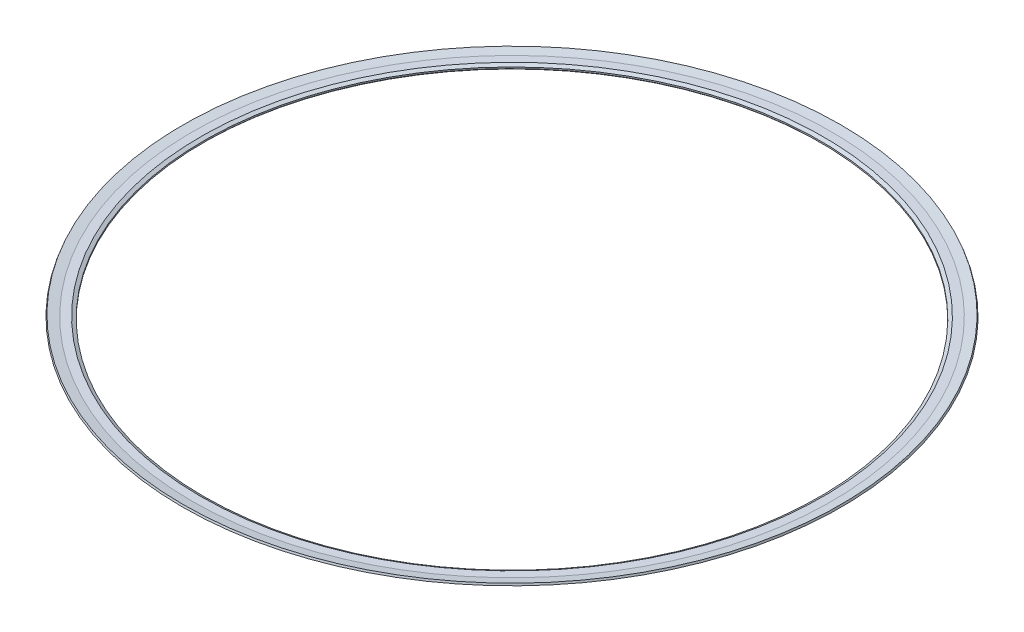
ISO-10303-21;
HEADER;
FILE_DESCRIPTION(('STEP AP214'),'2;1');
FILE_NAME('part.step','',(''),(''),'','','');
FILE_SCHEMA(('AUTOMOTIVE_DESIGN { 1 0 10303 214 1 1 1 1 }'));
ENDSEC;
DATA;
#1=APPLICATION_CONTEXT('core data for automotive mechanical design processes');
#2=APPLICATION_PROTOCOL_DEFINITION('international standard','automotive_design',2000,#1);
#3=PRODUCT_CONTEXT('',#1,'mechanical');
#4=PRODUCT('Part','Part','',(#3));
#5=PRODUCT_RELATED_PRODUCT_CATEGORY('part','',(#4));
#6=PRODUCT_DEFINITION_FORMATION('','',#4);
#7=PRODUCT_DEFINITION_CONTEXT('part definition',#1,'design');
#8=PRODUCT_DEFINITION('design','',#6,#7);
#9=PRODUCT_DEFINITION_SHAPE('','',#8);
#10=(LENGTH_UNIT() NAMED_UNIT(*) SI_UNIT(.MILLI.,.METRE.));
#11=(NAMED_UNIT(*) PLANE_ANGLE_UNIT() SI_UNIT($,.RADIAN.));
#12=(NAMED_UNIT(*) SI_UNIT($,.STERADIAN.) SOLID_ANGLE_UNIT());
#13=UNCERTAINTY_MEASURE_WITH_UNIT(LENGTH_MEASURE(1.E-05),#10,'distance_accuracy_value','');
#14=(GEOMETRIC_REPRESENTATION_CONTEXT(3) GLOBAL_UNCERTAINTY_ASSIGNED_CONTEXT((#13)) GLOBAL_UNIT_ASSIGNED_CONTEXT((#10,
#11,#12)) REPRESENTATION_CONTEXT('',''));
#15=CARTESIAN_POINT('',(0.,0.,0.));
#16=DIRECTION('',(0.,0.,1.));
#17=DIRECTION('',(1.,0.,0.));
#18=AXIS2_PLACEMENT_3D('',#15,#16,#17);
#19=CARTESIAN_POINT('',(0.,-36.,0.));
#20=DIRECTION('',(0.,1.,0.));
#21=DIRECTION('',(0.,0.,1.));
#22=AXIS2_PLACEMENT_3D('',#19,#20,#21);
#23=CONICAL_SURFACE('',#22,156.173294275924,1.07769638761275);
#24=CARTESIAN_POINT('',(0.,-34.7496827069459,0.));
#25=DIRECTION('',(0.,-1.,0.));
#26=DIRECTION('',(0.,0.,1.));
#27=AXIS2_PLACEMENT_3D('',#24,#25,#26);
#28=CIRCLE('',#27,158.5);
#29=CARTESIAN_POINT('',(0.,-34.7496827069459,158.5));
#30=VERTEX_POINT('',#29);
#31=EDGE_CURVE('E56',#30,#30,#28,.T.);
#32=ORIENTED_EDGE('',*,*,#31,.T.);
#33=EDGE_LOOP('',(#32));
#34=FACE_BOUND('',#33,.T.);
#35=CARTESIAN_POINT('',(0.,-33.85,0.));
#36=DIRECTION('',(0.,1.,0.));
#37=DIRECTION('',(0.,0.,1.));
#38=AXIS2_PLACEMENT_3D('',#35,#36,#37);
#39=CIRCLE('',#38,160.174212550472);
#40=CARTESIAN_POINT('',(0.,-33.85,160.174212550472));
#41=VERTEX_POINT('',#40);
#42=EDGE_CURVE('E52',#41,#41,#39,.T.);
#43=ORIENTED_EDGE('',*,*,#42,.T.);
#44=EDGE_LOOP('',(#43));
#45=FACE_BOUND('',#44,.T.);
#46=ADVANCED_FACE('F15',(#34,#45),#23,.F.);
#47=CARTESIAN_POINT('',(0.,-36.,0.));
#48=DIRECTION('',(0.,-1.,0.));
#49=DIRECTION('',(0.,0.,1.));
#50=AXIS2_PLACEMENT_3D('',#47,#48,#49);
#51=CYLINDRICAL_SURFACE('',#50,158.5);
#52=ORIENTED_EDGE('',*,*,#31,.F.);
#53=EDGE_LOOP('',(#52));
#54=FACE_BOUND('',#53,.T.);
#55=CARTESIAN_POINT('',(0.,-35.5,0.));
#56=DIRECTION('',(0.,-1.,0.));
#57=DIRECTION('',(0.,0.,1.));
#58=AXIS2_PLACEMENT_3D('',#55,#56,#57);
#59=CIRCLE('',#58,158.5);
#60=CARTESIAN_POINT('',(0.,-35.5,158.5));
#61=VERTEX_POINT('',#60);
#62=EDGE_CURVE('E48',#61,#61,#59,.T.);
#63=ORIENTED_EDGE('',*,*,#62,.T.);
#64=EDGE_LOOP('',(#63));
#65=FACE_BOUND('',#64,.T.);
#66=ADVANCED_FACE('F65',(#54,#65),#51,.F.);
#67=CARTESIAN_POINT('',(159.,-33.85,0.));
#68=DIRECTION('',(0.,1.,0.));
#69=DIRECTION('',(0.,0.,-1.));
#70=AXIS2_PLACEMENT_3D('',#67,#68,#69);
#71=PLANE('',#70);
#72=ORIENTED_EDGE('',*,*,#42,.F.);
#73=EDGE_LOOP('',(#72));
#74=FACE_BOUND('',#73,.T.);
#75=CARTESIAN_POINT('',(0.,-33.85,0.));
#76=DIRECTION('',(0.,-1.,0.));
#77=DIRECTION('',(0.,0.,1.));
#78=AXIS2_PLACEMENT_3D('',#75,#76,#77);
#79=CIRCLE('',#78,164.5);
#80=CARTESIAN_POINT('',(0.,-33.85,164.5));
#81=VERTEX_POINT('',#80);
#82=EDGE_CURVE('E44',#81,#81,#79,.T.);
#83=ORIENTED_EDGE('',*,*,#82,.F.);
#84=EDGE_LOOP('',(#83));
#85=FACE_BOUND('',#84,.T.);
#86=ADVANCED_FACE('F68',(#74,#85),#71,.T.);
#87=CARTESIAN_POINT('',(0.,-35.5,0.));
#88=DIRECTION('',(0.,-1.,0.));
#89=DIRECTION('',(0.,0.,1.));
#90=AXIS2_PLACEMENT_3D('',#87,#88,#89);
#91=CONICAL_SURFACE('',#90,158.5,0.785398163397388);
#92=ORIENTED_EDGE('',*,*,#62,.F.);
#93=EDGE_LOOP('',(#92));
#94=FACE_BOUND('',#93,.T.);
#95=CARTESIAN_POINT('',(0.,-36.,0.));
#96=DIRECTION('',(0.,-1.,0.));
#97=DIRECTION('',(0.,0.,1.));
#98=AXIS2_PLACEMENT_3D('',#95,#96,#97);
#99=CIRCLE('',#98,159.);
#100=CARTESIAN_POINT('',(0.,-36.,159.));
#101=VERTEX_POINT('',#100);
#102=EDGE_CURVE('E38',#101,#101,#99,.T.);
#103=ORIENTED_EDGE('',*,*,#102,.T.);
#104=EDGE_LOOP('',(#103));
#105=FACE_BOUND('',#104,.T.);
#106=ADVANCED_FACE('F72',(#94,#105),#91,.F.);
#107=CARTESIAN_POINT('',(0.,-33.,0.));
#108=DIRECTION('',(0.,1.,0.));
#109=DIRECTION('',(0.,0.,-1.));
#110=AXIS2_PLACEMENT_3D('',#107,#108,#109);
#111=CONICAL_SURFACE('',#110,169.150465252894,1.39001444991854);
#112=ORIENTED_EDGE('',*,*,#82,.T.);
#113=EDGE_LOOP('',(#112));
#114=FACE_BOUND('',#113,.T.);
#115=CARTESIAN_POINT('',(0.,-33.,0.));
#116=DIRECTION('',(0.,-1.,0.));
#117=DIRECTION('',(0.,0.,1.));
#118=AXIS2_PLACEMENT_3D('',#115,#116,#117);
#119=CIRCLE('',#118,169.150465252894);
#120=CARTESIAN_POINT('',(0.,-33.,169.150465252894));
#121=VERTEX_POINT('',#120);
#122=EDGE_CURVE('E31',#121,#121,#119,.T.);
#123=ORIENTED_EDGE('',*,*,#122,.F.);
#124=EDGE_LOOP('',(#123));
#125=FACE_BOUND('',#124,.T.);
#126=ADVANCED_FACE('F75',(#114,#125),#111,.F.);
#127=CARTESIAN_POINT('',(159.,-36.,0.));
#128=DIRECTION('',(0.,-1.,0.));
#129=DIRECTION('',(0.,0.,1.));
#130=AXIS2_PLACEMENT_3D('',#127,#128,#129);
#131=PLANE('',#130);
#132=CARTESIAN_POINT('',(0.,-36.,0.));
#133=DIRECTION('',(0.,-1.,0.));
#134=DIRECTION('',(0.,0.,1.));
#135=AXIS2_PLACEMENT_3D('',#132,#133,#134);
#136=CIRCLE('',#135,164.);
#137=CARTESIAN_POINT('',(0.,-36.,164.));
#138=VERTEX_POINT('',#137);
#139=EDGE_CURVE('E23',#138,#138,#136,.T.);
#140=ORIENTED_EDGE('',*,*,#139,.T.);
#141=EDGE_LOOP('',(#140));
#142=FACE_BOUND('',#141,.T.);
#143=ORIENTED_EDGE('',*,*,#102,.F.);
#144=EDGE_LOOP('',(#143));
#145=FACE_BOUND('',#144,.T.);
#146=ADVANCED_FACE('F79',(#142,#145),#131,.T.);
#147=CARTESIAN_POINT('',(0.,-33.9369234016533,0.));
#148=DIRECTION('',(0.,-1.,0.));
#149=DIRECTION('',(0.,0.,1.));
#150=AXIS2_PLACEMENT_3D('',#147,#148,#149);
#151=CONICAL_SURFACE('',#150,169.5,0.357074482453514);
#152=ORIENTED_EDGE('',*,*,#122,.T.);
#153=EDGE_LOOP('',(#152));
#154=FACE_BOUND('',#153,.T.);
#155=CARTESIAN_POINT('',(0.,-33.9369234016533,0.));
#156=DIRECTION('',(0.,-1.,0.));
#157=DIRECTION('',(0.,0.,1.));
#158=AXIS2_PLACEMENT_3D('',#155,#156,#157);
#159=CIRCLE('',#158,169.5);
#160=CARTESIAN_POINT('',(0.,-33.9369234016533,169.5));
#161=VERTEX_POINT('',#160);
#162=EDGE_CURVE('E10',#161,#161,#159,.T.);
#163=ORIENTED_EDGE('',*,*,#162,.F.);
#164=EDGE_LOOP('',(#163));
#165=FACE_BOUND('',#164,.T.);
#166=ADVANCED_FACE('F81',(#154,#165),#151,.T.);
#167=CARTESIAN_POINT('',(0.,-36.,0.));
#168=DIRECTION('',(0.,1.,0.));
#169=DIRECTION('',(0.,0.,-1.));
#170=AXIS2_PLACEMENT_3D('',#167,#168,#169);
#171=CONICAL_SURFACE('',#170,164.,1.21193374862338);
#172=ORIENTED_EDGE('',*,*,#139,.F.);
#173=EDGE_LOOP('',(#172));
#174=FACE_BOUND('',#173,.T.);
#175=ORIENTED_EDGE('',*,*,#162,.T.);
#176=EDGE_LOOP('',(#175));
#177=FACE_BOUND('',#176,.T.);
#178=ADVANCED_FACE('F17',(#174,#177),#171,.T.);
#179=CLOSED_SHELL('',(#46,#66,#86,#106,#126,#146,#166,#178));
#180=MANIFOLD_SOLID_BREP('B1',#179);
#181=ADVANCED_BREP_SHAPE_REPRESENTATION('',(#18,#180),#14);
#182=SHAPE_DEFINITION_REPRESENTATION(#9,#181);
ENDSEC;
END-ISO-10303-21;
